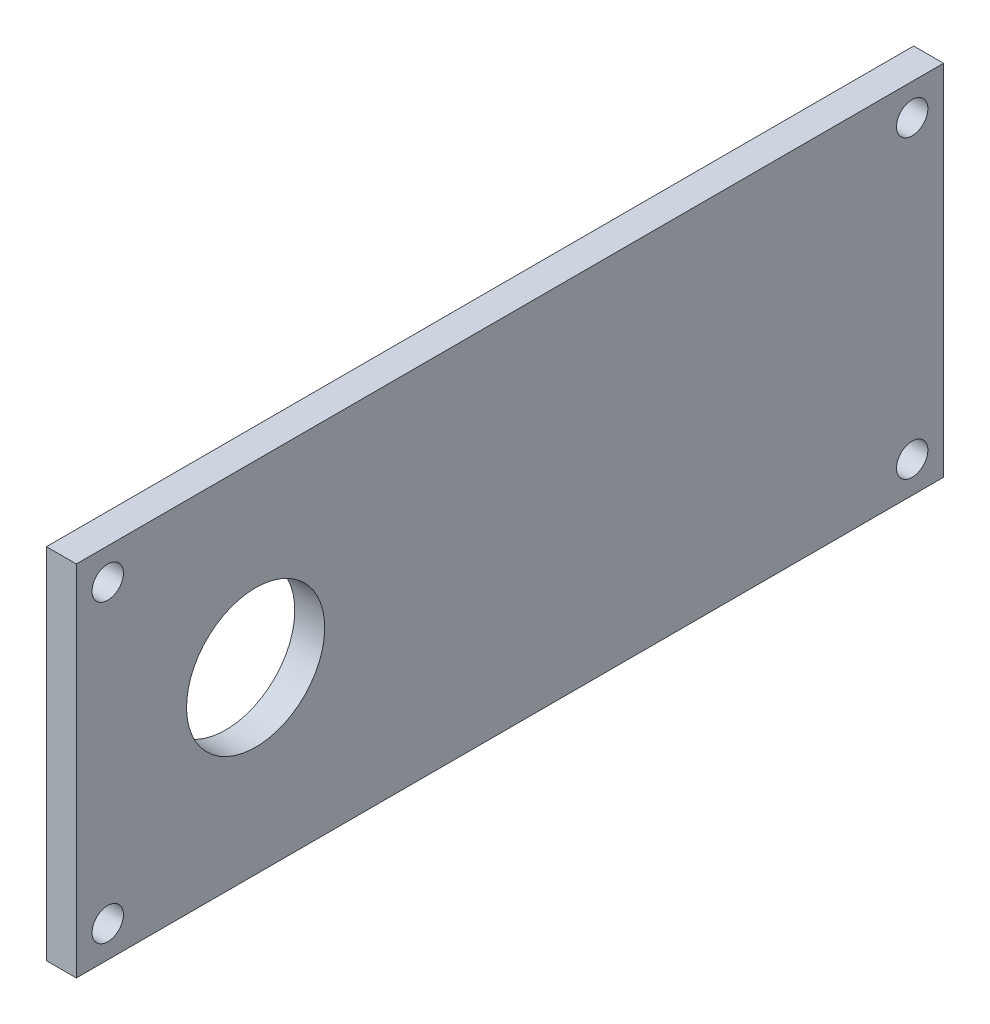
ISO-10303-21;
HEADER;
FILE_DESCRIPTION(('STEP AP214'),'2;1');
FILE_NAME('part.step','',(''),(''),'','','');
FILE_SCHEMA(('AUTOMOTIVE_DESIGN { 1 0 10303 214 1 1 1 1 }'));
ENDSEC;
DATA;
#1=APPLICATION_CONTEXT('core data for automotive mechanical design processes');
#2=APPLICATION_PROTOCOL_DEFINITION('international standard','automotive_design',2000,#1);
#3=PRODUCT_CONTEXT('',#1,'mechanical');
#4=PRODUCT('Part','Part','',(#3));
#5=PRODUCT_RELATED_PRODUCT_CATEGORY('part','',(#4));
#6=PRODUCT_DEFINITION_FORMATION('','',#4);
#7=PRODUCT_DEFINITION_CONTEXT('part definition',#1,'design');
#8=PRODUCT_DEFINITION('design','',#6,#7);
#9=PRODUCT_DEFINITION_SHAPE('','',#8);
#10=(LENGTH_UNIT() NAMED_UNIT(*) SI_UNIT(.MILLI.,.METRE.));
#11=(NAMED_UNIT(*) PLANE_ANGLE_UNIT() SI_UNIT($,.RADIAN.));
#12=(NAMED_UNIT(*) SI_UNIT($,.STERADIAN.) SOLID_ANGLE_UNIT());
#13=UNCERTAINTY_MEASURE_WITH_UNIT(LENGTH_MEASURE(1.E-05),#10,'distance_accuracy_value','');
#14=(GEOMETRIC_REPRESENTATION_CONTEXT(3) GLOBAL_UNCERTAINTY_ASSIGNED_CONTEXT((#13)) GLOBAL_UNIT_ASSIGNED_CONTEXT((#10,
#11,#12)) REPRESENTATION_CONTEXT('',''));
#15=CARTESIAN_POINT('',(0.,0.,0.));
#16=DIRECTION('',(0.,0.,1.));
#17=DIRECTION('',(1.,0.,0.));
#18=AXIS2_PLACEMENT_3D('',#15,#16,#17);
#19=CARTESIAN_POINT('',(-87.7327380887072,6.18052461297292E-13,0.));
#20=DIRECTION('',(-1.,0.,0.));
#21=DIRECTION('',(0.,-1.,0.));
#22=AXIS2_PLACEMENT_3D('',#19,#20,#21);
#23=PLANE('',#22);
#24=CARTESIAN_POINT('',(-87.7327380887078,-74.6077986319809,-25.1580486265835));
#25=DIRECTION('',(-1.,0.,0.));
#26=DIRECTION('',(0.,-1.,0.));
#27=AXIS2_PLACEMENT_3D('',#24,#25,#26);
#28=CIRCLE('',#27,2.5);
#29=CARTESIAN_POINT('',(-87.7327380887077,-72.1077986319809,-25.1580486265835));
#30=VERTEX_POINT('',#29);
#31=EDGE_CURVE('E126',#30,#30,#28,.T.);
#32=ORIENTED_EDGE('',*,*,#31,.F.);
#33=EDGE_LOOP('',(#32));
#34=FACE_BOUND('',#33,.T.);
#35=CARTESIAN_POINT('',(-87.7327380887078,-74.6077986319811,-153.258048626583));
#36=DIRECTION('',(-1.,0.,0.));
#37=DIRECTION('',(0.,-1.,0.));
#38=AXIS2_PLACEMENT_3D('',#35,#36,#37);
#39=CIRCLE('',#38,2.5);
#40=CARTESIAN_POINT('',(-87.7327380887077,-72.1077986319811,-153.258048626583));
#41=VERTEX_POINT('',#40);
#42=EDGE_CURVE('E114',#41,#41,#39,.T.);
#43=ORIENTED_EDGE('',*,*,#42,.F.);
#44=EDGE_LOOP('',(#43));
#45=FACE_BOUND('',#44,.T.);
#46=DIRECTION('',(0.,-1.,0.));
#47=VECTOR('',#46,1.);
#48=CARTESIAN_POINT('',(-87.7327380887074,-22.5077986319807,-158.258048626584));
#49=LINE('',#48,#47);
#50=CARTESIAN_POINT('',(-87.7327380887074,-22.5077986319807,-158.258048626584));
#51=VERTEX_POINT('',#50);
#52=CARTESIAN_POINT('',(-87.7327380887078,-79.6077986319808,-158.258048626584));
#53=VERTEX_POINT('',#52);
#54=EDGE_CURVE('E84',#51,#53,#49,.T.);
#55=ORIENTED_EDGE('',*,*,#54,.T.);
#56=DIRECTION('',(0.,0.,1.));
#57=VECTOR('',#56,1.);
#58=CARTESIAN_POINT('',(-87.7327380887078,-79.6077986319808,-158.258048626584));
#59=LINE('',#58,#57);
#60=CARTESIAN_POINT('',(-87.7327380887078,-79.6077986319806,-20.1580486265835));
#61=VERTEX_POINT('',#60);
#62=EDGE_CURVE('E79',#53,#61,#59,.T.);
#63=ORIENTED_EDGE('',*,*,#62,.T.);
#64=DIRECTION('',(0.,1.,0.));
#65=VECTOR('',#64,1.);
#66=CARTESIAN_POINT('',(-87.7327380887078,-79.6077986319806,-20.1580486265835));
#67=LINE('',#66,#65);
#68=CARTESIAN_POINT('',(-87.7327380887074,-22.5077986319806,-20.1580486265835));
#69=VERTEX_POINT('',#68);
#70=EDGE_CURVE('E82',#61,#69,#67,.T.);
#71=ORIENTED_EDGE('',*,*,#70,.T.);
#72=DIRECTION('',(0.,0.,-1.));
#73=VECTOR('',#72,1.);
#74=CARTESIAN_POINT('',(-87.7327380887074,-22.5077986319806,-20.1580486265835));
#75=LINE('',#74,#73);
#76=EDGE_CURVE('E49',#69,#51,#75,.T.);
#77=ORIENTED_EDGE('',*,*,#76,.T.);
#78=EDGE_LOOP('',(#55,#63,#71,#77));
#79=FACE_BOUND('',#78,.T.);
#80=CARTESIAN_POINT('',(-87.7327380887074,-27.507798631981,-153.258048626583));
#81=DIRECTION('',(-1.,0.,0.));
#82=DIRECTION('',(0.,-1.,0.));
#83=AXIS2_PLACEMENT_3D('',#80,#81,#82);
#84=CIRCLE('',#83,2.5);
#85=CARTESIAN_POINT('',(-87.7327380887074,-25.007798631981,-153.258048626583));
#86=VERTEX_POINT('',#85);
#87=EDGE_CURVE('E99',#86,#86,#84,.T.);
#88=ORIENTED_EDGE('',*,*,#87,.F.);
#89=EDGE_LOOP('',(#88));
#90=FACE_BOUND('',#89,.T.);
#91=CARTESIAN_POINT('',(-87.7327380887074,-27.5077986319808,-25.1580486265835));
#92=DIRECTION('',(-1.,0.,0.));
#93=DIRECTION('',(0.,-1.,0.));
#94=AXIS2_PLACEMENT_3D('',#91,#92,#93);
#95=CIRCLE('',#94,2.5);
#96=CARTESIAN_POINT('',(-87.7327380887074,-25.0077986319808,-25.1580486265835));
#97=VERTEX_POINT('',#96);
#98=EDGE_CURVE('E120',#97,#97,#95,.T.);
#99=ORIENTED_EDGE('',*,*,#98,.F.);
#100=EDGE_LOOP('',(#99));
#101=FACE_BOUND('',#100,.T.);
#102=CARTESIAN_POINT('',(-87.7327380887076,-51.0577986319808,-48.7080486265835));
#103=DIRECTION('',(-1.,0.,0.));
#104=DIRECTION('',(0.,-1.,0.));
#105=AXIS2_PLACEMENT_3D('',#102,#103,#104);
#106=CIRCLE('',#105,11.);
#107=CARTESIAN_POINT('',(-87.7327380887075,-40.0577986319809,-48.7080486265835));
#108=VERTEX_POINT('',#107);
#109=EDGE_CURVE('E132',#108,#108,#106,.T.);
#110=ORIENTED_EDGE('',*,*,#109,.F.);
#111=EDGE_LOOP('',(#110));
#112=FACE_BOUND('',#111,.T.);
#113=ADVANCED_FACE('F32',(#34,#45,#79,#90,#101,#112),#23,.T.);
#114=CARTESIAN_POINT('',(-82.9702380887072,5.84796101544812E-13,0.));
#115=DIRECTION('',(-1.,0.,0.));
#116=DIRECTION('',(0.,-1.,0.));
#117=AXIS2_PLACEMENT_3D('',#114,#115,#116);
#118=PLANE('',#117);
#119=DIRECTION('',(0.,-1.,0.));
#120=VECTOR('',#119,1.);
#121=CARTESIAN_POINT('',(-82.9702380887074,-22.5077986319807,-158.258048626584));
#122=LINE('',#121,#120);
#123=CARTESIAN_POINT('',(-82.9702380887074,-22.5077986319807,-158.258048626584));
#124=VERTEX_POINT('',#123);
#125=CARTESIAN_POINT('',(-82.9702380887078,-79.6077986319808,-158.258048626584));
#126=VERTEX_POINT('',#125);
#127=EDGE_CURVE('E96',#124,#126,#122,.T.);
#128=ORIENTED_EDGE('',*,*,#127,.F.);
#129=DIRECTION('',(0.,0.,-1.));
#130=VECTOR('',#129,1.);
#131=CARTESIAN_POINT('',(-82.9702380887074,-22.5077986319807,-20.1580486265835));
#132=LINE('',#131,#130);
#133=CARTESIAN_POINT('',(-82.9702380887074,-22.5077986319807,-20.1580486265835));
#134=VERTEX_POINT('',#133);
#135=EDGE_CURVE('E72',#134,#124,#132,.T.);
#136=ORIENTED_EDGE('',*,*,#135,.F.);
#137=DIRECTION('',(0.,1.,0.));
#138=VECTOR('',#137,1.);
#139=CARTESIAN_POINT('',(-82.9702380887078,-79.6077986319806,-20.1580486265835));
#140=LINE('',#139,#138);
#141=CARTESIAN_POINT('',(-82.9702380887078,-79.6077986319806,-20.1580486265835));
#142=VERTEX_POINT('',#141);
#143=EDGE_CURVE('E66',#142,#134,#140,.T.);
#144=ORIENTED_EDGE('',*,*,#143,.F.);
#145=DIRECTION('',(0.,0.,1.));
#146=VECTOR('',#145,1.);
#147=CARTESIAN_POINT('',(-82.9702380887078,-79.6077986319808,-158.258048626584));
#148=LINE('',#147,#146);
#149=EDGE_CURVE('E88',#126,#142,#148,.T.);
#150=ORIENTED_EDGE('',*,*,#149,.F.);
#151=EDGE_LOOP('',(#128,#136,#144,#150));
#152=FACE_BOUND('',#151,.T.);
#153=CARTESIAN_POINT('',(-82.9702380887074,-27.5077986319811,-153.258048626583));
#154=DIRECTION('',(-1.,0.,0.));
#155=DIRECTION('',(0.,-1.,0.));
#156=AXIS2_PLACEMENT_3D('',#153,#154,#155);
#157=CIRCLE('',#156,2.5);
#158=CARTESIAN_POINT('',(-82.9702380887074,-25.0077986319811,-153.258048626583));
#159=VERTEX_POINT('',#158);
#160=EDGE_CURVE('E111',#159,#159,#157,.T.);
#161=ORIENTED_EDGE('',*,*,#160,.T.);
#162=EDGE_LOOP('',(#161));
#163=FACE_BOUND('',#162,.T.);
#164=CARTESIAN_POINT('',(-82.9702380887078,-74.6077986319811,-153.258048626583));
#165=DIRECTION('',(-1.,0.,0.));
#166=DIRECTION('',(0.,-1.,0.));
#167=AXIS2_PLACEMENT_3D('',#164,#165,#166);
#168=CIRCLE('',#167,2.5);
#169=CARTESIAN_POINT('',(-82.9702380887077,-72.1077986319811,-153.258048626583));
#170=VERTEX_POINT('',#169);
#171=EDGE_CURVE('E117',#170,#170,#168,.T.);
#172=ORIENTED_EDGE('',*,*,#171,.T.);
#173=EDGE_LOOP('',(#172));
#174=FACE_BOUND('',#173,.T.);
#175=CARTESIAN_POINT('',(-82.9702380887074,-27.5077986319809,-25.1580486265835));
#176=DIRECTION('',(-1.,0.,0.));
#177=DIRECTION('',(0.,-1.,0.));
#178=AXIS2_PLACEMENT_3D('',#175,#176,#177);
#179=CIRCLE('',#178,2.5);
#180=CARTESIAN_POINT('',(-82.9702380887074,-25.0077986319809,-25.1580486265835));
#181=VERTEX_POINT('',#180);
#182=EDGE_CURVE('E123',#181,#181,#179,.T.);
#183=ORIENTED_EDGE('',*,*,#182,.T.);
#184=EDGE_LOOP('',(#183));
#185=FACE_BOUND('',#184,.T.);
#186=CARTESIAN_POINT('',(-82.9702380887078,-74.6077986319809,-25.1580486265835));
#187=DIRECTION('',(-1.,0.,0.));
#188=DIRECTION('',(0.,-1.,0.));
#189=AXIS2_PLACEMENT_3D('',#186,#187,#188);
#190=CIRCLE('',#189,2.5);
#191=CARTESIAN_POINT('',(-82.9702380887077,-72.1077986319809,-25.1580486265835));
#192=VERTEX_POINT('',#191);
#193=EDGE_CURVE('E129',#192,#192,#190,.T.);
#194=ORIENTED_EDGE('',*,*,#193,.T.);
#195=EDGE_LOOP('',(#194));
#196=FACE_BOUND('',#195,.T.);
#197=CARTESIAN_POINT('',(-82.9702380887076,-51.0577986319809,-48.7080486265835));
#198=DIRECTION('',(-1.,0.,0.));
#199=DIRECTION('',(0.,-1.,0.));
#200=AXIS2_PLACEMENT_3D('',#197,#198,#199);
#201=CIRCLE('',#200,11.);
#202=CARTESIAN_POINT('',(-82.9702380887075,-40.0577986319809,-48.7080486265835));
#203=VERTEX_POINT('',#202);
#204=EDGE_CURVE('E135',#203,#203,#201,.T.);
#205=ORIENTED_EDGE('',*,*,#204,.T.);
#206=EDGE_LOOP('',(#205));
#207=FACE_BOUND('',#206,.T.);
#208=ADVANCED_FACE('F107',(#152,#163,#174,#185,#196,#207),#118,.F.);
#209=CARTESIAN_POINT('',(-87.7327380887074,-22.5077986319807,-158.258048626584));
#210=DIRECTION('',(0.,0.,1.));
#211=DIRECTION('',(1.,0.,0.));
#212=AXIS2_PLACEMENT_3D('',#209,#210,#211);
#213=PLANE('',#212);
#214=ORIENTED_EDGE('',*,*,#127,.T.);
#215=DIRECTION('',(1.,0.,0.));
#216=VECTOR('',#215,1.);
#217=CARTESIAN_POINT('',(-87.7327380887078,-79.6077986319808,-158.258048626584));
#218=LINE('',#217,#216);
#219=EDGE_CURVE('E11',#53,#126,#218,.T.);
#220=ORIENTED_EDGE('',*,*,#219,.F.);
#221=ORIENTED_EDGE('',*,*,#54,.F.);
#222=DIRECTION('',(1.,0.,0.));
#223=VECTOR('',#222,1.);
#224=CARTESIAN_POINT('',(-87.7327380887074,-22.5077986319807,-158.258048626584));
#225=LINE('',#224,#223);
#226=EDGE_CURVE('E92',#51,#124,#225,.T.);
#227=ORIENTED_EDGE('',*,*,#226,.T.);
#228=EDGE_LOOP('',(#214,#220,#221,#227));
#229=FACE_BOUND('',#228,.T.);
#230=ADVANCED_FACE('F34',(#229),#213,.F.);
#231=CARTESIAN_POINT('',(-87.7327380887078,-79.6077986319808,-158.258048626584));
#232=DIRECTION('',(0.,1.,0.));
#233=DIRECTION('',(-1.,0.,0.));
#234=AXIS2_PLACEMENT_3D('',#231,#232,#233);
#235=PLANE('',#234);
#236=ORIENTED_EDGE('',*,*,#149,.T.);
#237=DIRECTION('',(1.,0.,0.));
#238=VECTOR('',#237,1.);
#239=CARTESIAN_POINT('',(-87.7327380887078,-79.6077986319806,-20.1580486265835));
#240=LINE('',#239,#238);
#241=EDGE_CURVE('E41',#61,#142,#240,.T.);
#242=ORIENTED_EDGE('',*,*,#241,.F.);
#243=ORIENTED_EDGE('',*,*,#62,.F.);
#244=ORIENTED_EDGE('',*,*,#219,.T.);
#245=EDGE_LOOP('',(#236,#242,#243,#244));
#246=FACE_BOUND('',#245,.T.);
#247=ADVANCED_FACE('F87',(#246),#235,.F.);
#248=CARTESIAN_POINT('',(-87.7327380887078,-79.6077986319806,-20.1580486265835));
#249=DIRECTION('',(0.,0.,-1.));
#250=DIRECTION('',(-1.,0.,0.));
#251=AXIS2_PLACEMENT_3D('',#248,#249,#250);
#252=PLANE('',#251);
#253=ORIENTED_EDGE('',*,*,#143,.T.);
#254=DIRECTION('',(1.,0.,0.));
#255=VECTOR('',#254,1.);
#256=CARTESIAN_POINT('',(-87.7327380887074,-22.5077986319806,-20.1580486265835));
#257=LINE('',#256,#255);
#258=EDGE_CURVE('E89',#69,#134,#257,.T.);
#259=ORIENTED_EDGE('',*,*,#258,.F.);
#260=ORIENTED_EDGE('',*,*,#70,.F.);
#261=ORIENTED_EDGE('',*,*,#241,.T.);
#262=EDGE_LOOP('',(#253,#259,#260,#261));
#263=FACE_BOUND('',#262,.T.);
#264=ADVANCED_FACE('F90',(#263),#252,.F.);
#265=CARTESIAN_POINT('',(-87.7327380887074,-22.5077986319806,-20.1580486265835));
#266=DIRECTION('',(0.,-1.,0.));
#267=DIRECTION('',(1.,0.,0.));
#268=AXIS2_PLACEMENT_3D('',#265,#266,#267);
#269=PLANE('',#268);
#270=ORIENTED_EDGE('',*,*,#135,.T.);
#271=ORIENTED_EDGE('',*,*,#226,.F.);
#272=ORIENTED_EDGE('',*,*,#76,.F.);
#273=ORIENTED_EDGE('',*,*,#258,.T.);
#274=EDGE_LOOP('',(#270,#271,#272,#273));
#275=FACE_BOUND('',#274,.T.);
#276=ADVANCED_FACE('F104',(#275),#269,.F.);
#277=CARTESIAN_POINT('',(-87.7327380887074,-27.507798631981,-153.258048626583));
#278=DIRECTION('',(1.,0.,0.));
#279=DIRECTION('',(0.,1.,0.));
#280=AXIS2_PLACEMENT_3D('',#277,#278,#279);
#281=CYLINDRICAL_SURFACE('',#280,2.5);
#282=CARTESIAN_POINT('',(-87.7327380887074,-25.007798631981,-153.258048626583));
#283=CARTESIAN_POINT('',(-87.6831287137074,-25.007798631981,-153.258048626583));
#284=CARTESIAN_POINT('',(-87.6335193387074,-25.007798631981,-153.258048626583));
#285=CARTESIAN_POINT('',(-87.5343005887074,-25.007798631981,-153.258048626583));
#286=CARTESIAN_POINT('',(-87.4846912137074,-25.007798631981,-153.258048626583));
#287=CARTESIAN_POINT('',(-87.3854724637074,-25.007798631981,-153.258048626583));
#288=CARTESIAN_POINT('',(-87.3358630887074,-25.007798631981,-153.258048626583));
#289=CARTESIAN_POINT('',(-87.2366443387074,-25.007798631981,-153.258048626583));
#290=CARTESIAN_POINT('',(-87.1870349637074,-25.007798631981,-153.258048626583));
#291=CARTESIAN_POINT('',(-87.0878162137074,-25.007798631981,-153.258048626583));
#292=CARTESIAN_POINT('',(-87.0382068387074,-25.007798631981,-153.258048626583));
#293=CARTESIAN_POINT('',(-86.9389880887074,-25.007798631981,-153.258048626583));
#294=CARTESIAN_POINT('',(-86.8893787137074,-25.007798631981,-153.258048626583));
#295=CARTESIAN_POINT('',(-86.7901599637074,-25.007798631981,-153.258048626583));
#296=CARTESIAN_POINT('',(-86.7405505887074,-25.007798631981,-153.258048626583));
#297=CARTESIAN_POINT('',(-86.6413318387074,-25.007798631981,-153.258048626583));
#298=CARTESIAN_POINT('',(-86.5917224637074,-25.007798631981,-153.258048626583));
#299=CARTESIAN_POINT('',(-86.4925037137074,-25.007798631981,-153.258048626583));
#300=CARTESIAN_POINT('',(-86.4428943387074,-25.007798631981,-153.258048626583));
#301=CARTESIAN_POINT('',(-86.3436755887074,-25.007798631981,-153.258048626583));
#302=CARTESIAN_POINT('',(-86.2940662137074,-25.007798631981,-153.258048626583));
#303=CARTESIAN_POINT('',(-86.1948474637074,-25.007798631981,-153.258048626583));
#304=CARTESIAN_POINT('',(-86.1452380887074,-25.007798631981,-153.258048626583));
#305=CARTESIAN_POINT('',(-86.0460193387074,-25.007798631981,-153.258048626583));
#306=CARTESIAN_POINT('',(-85.9964099637074,-25.0077986319811,-153.258048626583));
#307=CARTESIAN_POINT('',(-85.8971912137074,-25.0077986319811,-153.258048626583));
#308=CARTESIAN_POINT('',(-85.8475818387074,-25.0077986319811,-153.258048626583));
#309=CARTESIAN_POINT('',(-85.7483630887074,-25.0077986319811,-153.258048626583));
#310=CARTESIAN_POINT('',(-85.6987537137074,-25.0077986319811,-153.258048626583));
#311=CARTESIAN_POINT('',(-85.5995349637074,-25.0077986319811,-153.258048626583));
#312=CARTESIAN_POINT('',(-85.5499255887074,-25.0077986319811,-153.258048626583));
#313=CARTESIAN_POINT('',(-85.4507068387074,-25.0077986319811,-153.258048626583));
#314=CARTESIAN_POINT('',(-85.4010974637074,-25.0077986319811,-153.258048626583));
#315=CARTESIAN_POINT('',(-85.3018787137074,-25.0077986319811,-153.258048626583));
#316=CARTESIAN_POINT('',(-85.2522693387074,-25.0077986319811,-153.258048626583));
#317=CARTESIAN_POINT('',(-85.1530505887074,-25.0077986319811,-153.258048626583));
#318=CARTESIAN_POINT('',(-85.1034412137074,-25.0077986319811,-153.258048626583));
#319=CARTESIAN_POINT('',(-85.0042224637074,-25.0077986319811,-153.258048626583));
#320=CARTESIAN_POINT('',(-84.9546130887074,-25.0077986319811,-153.258048626583));
#321=CARTESIAN_POINT('',(-84.8553943387074,-25.0077986319811,-153.258048626583));
#322=CARTESIAN_POINT('',(-84.8057849637074,-25.0077986319811,-153.258048626583));
#323=CARTESIAN_POINT('',(-84.7065662137074,-25.0077986319811,-153.258048626583));
#324=CARTESIAN_POINT('',(-84.6569568387074,-25.0077986319811,-153.258048626583));
#325=CARTESIAN_POINT('',(-84.5577380887074,-25.0077986319811,-153.258048626583));
#326=CARTESIAN_POINT('',(-84.5081287137074,-25.0077986319811,-153.258048626583));
#327=CARTESIAN_POINT('',(-84.4089099637074,-25.0077986319811,-153.258048626583));
#328=CARTESIAN_POINT('',(-84.3593005887074,-25.0077986319811,-153.258048626583));
#329=CARTESIAN_POINT('',(-84.2600818387074,-25.0077986319811,-153.258048626583));
#330=CARTESIAN_POINT('',(-84.2104724637074,-25.0077986319811,-153.258048626583));
#331=CARTESIAN_POINT('',(-84.1112537137074,-25.0077986319811,-153.258048626583));
#332=CARTESIAN_POINT('',(-84.0616443387074,-25.0077986319811,-153.258048626583));
#333=CARTESIAN_POINT('',(-83.9624255887074,-25.0077986319811,-153.258048626583));
#334=CARTESIAN_POINT('',(-83.9128162137074,-25.0077986319811,-153.258048626583));
#335=CARTESIAN_POINT('',(-83.8135974637074,-25.0077986319811,-153.258048626583));
#336=CARTESIAN_POINT('',(-83.7639880887074,-25.0077986319811,-153.258048626583));
#337=CARTESIAN_POINT('',(-83.6647693387074,-25.0077986319811,-153.258048626583));
#338=CARTESIAN_POINT('',(-83.6151599637074,-25.0077986319811,-153.258048626583));
#339=CARTESIAN_POINT('',(-83.5159412137074,-25.0077986319811,-153.258048626583));
#340=CARTESIAN_POINT('',(-83.4663318387074,-25.0077986319811,-153.258048626583));
#341=CARTESIAN_POINT('',(-83.3671130887074,-25.0077986319811,-153.258048626583));
#342=CARTESIAN_POINT('',(-83.3175037137074,-25.0077986319811,-153.258048626583));
#343=CARTESIAN_POINT('',(-83.2182849637074,-25.0077986319811,-153.258048626583));
#344=CARTESIAN_POINT('',(-83.1686755887074,-25.0077986319811,-153.258048626583));
#345=CARTESIAN_POINT('',(-83.0694568387074,-25.0077986319811,-153.258048626583));
#346=CARTESIAN_POINT('',(-83.0198474637074,-25.0077986319811,-153.258048626583));
#347=CARTESIAN_POINT('',(-82.9702380887074,-25.0077986319811,-153.258048626583));
#348=B_SPLINE_CURVE_WITH_KNOTS('',3,(#282,#283,#284,#285,#286,#287,#288,#289,#290,#291,#292,
#293,#294,#295,#296,#297,#298,#299,#300,#301,#302,#303,#304,#305,#306,#307,#308,#309,#310,#311,
#312,#313,#314,#315,#316,#317,#318,#319,#320,#321,#322,#323,#324,#325,#326,#327,#328,#329,#330,
#331,#332,#333,#334,#335,#336,#337,#338,#339,#340,#341,#342,#343,#344,#345,#346,#347),
.UNSPECIFIED.,.F.,.F.,(4,2,2,2,2,2,2,2,2,2,2,2,2,2,2,2,2,2,2,2,2,2,2,2,2,2,2,2,2,2,2,2,4),(0.,
0.148828125,0.29765625,0.446484375,0.5953125,0.744140625,0.892968750000001,1.041796875,1.190625,
1.339453125,1.48828125,1.637109375,1.7859375,1.934765625,2.08359375,2.232421875,2.38125,
2.530078125,2.67890625,2.827734375,2.9765625,3.125390625,3.27421875,3.423046875,3.571875,
3.720703125,3.86953125,4.018359375,4.1671875,4.316015625,4.46484375,4.613671875,4.7625),.UNSPECIFIED.);
#349=EDGE_CURVE('BSEAM154',#86,#159,#348,.T.);
#350=ORIENTED_EDGE('',*,*,#87,.T.);
#351=ORIENTED_EDGE('',*,*,#160,.F.);
#352=ORIENTED_EDGE('',*,*,#349,.T.);
#353=ORIENTED_EDGE('',*,*,#349,.F.);
#354=EDGE_LOOP('',(#350,#352,#351,#353));
#355=FACE_BOUND('',#354,.T.);
#356=ADVANCED_FACE('F154',(#355),#281,.F.);
#357=CARTESIAN_POINT('',(-87.7327380887078,-74.6077986319811,-153.258048626583));
#358=DIRECTION('',(1.,0.,0.));
#359=DIRECTION('',(0.,1.,0.));
#360=AXIS2_PLACEMENT_3D('',#357,#358,#359);
#361=CYLINDRICAL_SURFACE('',#360,2.5);
#362=CARTESIAN_POINT('',(-87.7327380887077,-72.1077986319811,-153.258048626583));
#363=CARTESIAN_POINT('',(-87.6831287137078,-72.1077986319811,-153.258048626583));
#364=CARTESIAN_POINT('',(-87.6335193387077,-72.1077986319811,-153.258048626583));
#365=CARTESIAN_POINT('',(-87.5343005887078,-72.1077986319811,-153.258048626583));
#366=CARTESIAN_POINT('',(-87.4846912137077,-72.1077986319811,-153.258048626583));
#367=CARTESIAN_POINT('',(-87.3854724637078,-72.1077986319811,-153.258048626583));
#368=CARTESIAN_POINT('',(-87.3358630887078,-72.1077986319811,-153.258048626583));
#369=CARTESIAN_POINT('',(-87.2366443387078,-72.1077986319811,-153.258048626583));
#370=CARTESIAN_POINT('',(-87.1870349637077,-72.1077986319811,-153.258048626583));
#371=CARTESIAN_POINT('',(-87.0878162137078,-72.1077986319811,-153.258048626583));
#372=CARTESIAN_POINT('',(-87.0382068387078,-72.1077986319811,-153.258048626583));
#373=CARTESIAN_POINT('',(-86.9389880887078,-72.1077986319811,-153.258048626583));
#374=CARTESIAN_POINT('',(-86.8893787137077,-72.1077986319811,-153.258048626583));
#375=CARTESIAN_POINT('',(-86.7901599637078,-72.1077986319811,-153.258048626583));
#376=CARTESIAN_POINT('',(-86.7405505887077,-72.1077986319811,-153.258048626583));
#377=CARTESIAN_POINT('',(-86.6413318387078,-72.1077986319811,-153.258048626583));
#378=CARTESIAN_POINT('',(-86.5917224637078,-72.1077986319811,-153.258048626583));
#379=CARTESIAN_POINT('',(-86.4925037137078,-72.1077986319811,-153.258048626583));
#380=CARTESIAN_POINT('',(-86.4428943387077,-72.1077986319811,-153.258048626583));
#381=CARTESIAN_POINT('',(-86.3436755887078,-72.1077986319811,-153.258048626583));
#382=CARTESIAN_POINT('',(-86.2940662137078,-72.1077986319811,-153.258048626583));
#383=CARTESIAN_POINT('',(-86.1948474637078,-72.1077986319811,-153.258048626583));
#384=CARTESIAN_POINT('',(-86.1452380887077,-72.1077986319811,-153.258048626583));
#385=CARTESIAN_POINT('',(-86.0460193387078,-72.1077986319811,-153.258048626583));
#386=CARTESIAN_POINT('',(-85.9964099637077,-72.1077986319811,-153.258048626583));
#387=CARTESIAN_POINT('',(-85.8971912137078,-72.1077986319811,-153.258048626583));
#388=CARTESIAN_POINT('',(-85.8475818387078,-72.1077986319811,-153.258048626583));
#389=CARTESIAN_POINT('',(-85.7483630887078,-72.1077986319811,-153.258048626583));
#390=CARTESIAN_POINT('',(-85.6987537137077,-72.1077986319811,-153.258048626583));
#391=CARTESIAN_POINT('',(-85.5995349637078,-72.1077986319811,-153.258048626583));
#392=CARTESIAN_POINT('',(-85.5499255887078,-72.1077986319811,-153.258048626583));
#393=CARTESIAN_POINT('',(-85.4507068387078,-72.1077986319811,-153.258048626583));
#394=CARTESIAN_POINT('',(-85.4010974637077,-72.1077986319811,-153.258048626583));
#395=CARTESIAN_POINT('',(-85.3018787137078,-72.1077986319811,-153.258048626583));
#396=CARTESIAN_POINT('',(-85.2522693387077,-72.1077986319811,-153.258048626583));
#397=CARTESIAN_POINT('',(-85.1530505887078,-72.1077986319811,-153.258048626583));
#398=CARTESIAN_POINT('',(-85.1034412137078,-72.1077986319811,-153.258048626583));
#399=CARTESIAN_POINT('',(-85.0042224637078,-72.1077986319811,-153.258048626583));
#400=CARTESIAN_POINT('',(-84.9546130887077,-72.1077986319811,-153.258048626583));
#401=CARTESIAN_POINT('',(-84.8553943387078,-72.1077986319811,-153.258048626583));
#402=CARTESIAN_POINT('',(-84.8057849637078,-72.1077986319811,-153.258048626583));
#403=CARTESIAN_POINT('',(-84.7065662137078,-72.1077986319811,-153.258048626583));
#404=CARTESIAN_POINT('',(-84.6569568387077,-72.1077986319811,-153.258048626583));
#405=CARTESIAN_POINT('',(-84.5577380887078,-72.1077986319811,-153.258048626583));
#406=CARTESIAN_POINT('',(-84.5081287137077,-72.1077986319811,-153.258048626583));
#407=CARTESIAN_POINT('',(-84.4089099637078,-72.1077986319811,-153.258048626583));
#408=CARTESIAN_POINT('',(-84.3593005887078,-72.1077986319811,-153.258048626583));
#409=CARTESIAN_POINT('',(-84.2600818387078,-72.1077986319811,-153.258048626583));
#410=CARTESIAN_POINT('',(-84.2104724637077,-72.1077986319811,-153.258048626583));
#411=CARTESIAN_POINT('',(-84.1112537137078,-72.1077986319811,-153.258048626583));
#412=CARTESIAN_POINT('',(-84.0616443387078,-72.1077986319811,-153.258048626583));
#413=CARTESIAN_POINT('',(-83.9624255887078,-72.1077986319811,-153.258048626583));
#414=CARTESIAN_POINT('',(-83.9128162137077,-72.1077986319811,-153.258048626583));
#415=CARTESIAN_POINT('',(-83.8135974637078,-72.1077986319811,-153.258048626583));
#416=CARTESIAN_POINT('',(-83.7639880887077,-72.1077986319811,-153.258048626583));
#417=CARTESIAN_POINT('',(-83.6647693387078,-72.1077986319811,-153.258048626583));
#418=CARTESIAN_POINT('',(-83.6151599637078,-72.1077986319811,-153.258048626583));
#419=CARTESIAN_POINT('',(-83.5159412137078,-72.1077986319811,-153.258048626583));
#420=CARTESIAN_POINT('',(-83.4663318387077,-72.1077986319811,-153.258048626583));
#421=CARTESIAN_POINT('',(-83.3671130887078,-72.1077986319811,-153.258048626583));
#422=CARTESIAN_POINT('',(-83.3175037137078,-72.1077986319811,-153.258048626583));
#423=CARTESIAN_POINT('',(-83.2182849637078,-72.1077986319811,-153.258048626583));
#424=CARTESIAN_POINT('',(-83.1686755887077,-72.1077986319811,-153.258048626583));
#425=CARTESIAN_POINT('',(-83.0694568387078,-72.1077986319811,-153.258048626583));
#426=CARTESIAN_POINT('',(-83.0198474637077,-72.1077986319811,-153.258048626583));
#427=CARTESIAN_POINT('',(-82.9702380887077,-72.1077986319811,-153.258048626583));
#428=B_SPLINE_CURVE_WITH_KNOTS('',3,(#362,#363,#364,#365,#366,#367,#368,#369,#370,#371,#372,
#373,#374,#375,#376,#377,#378,#379,#380,#381,#382,#383,#384,#385,#386,#387,#388,#389,#390,#391,
#392,#393,#394,#395,#396,#397,#398,#399,#400,#401,#402,#403,#404,#405,#406,#407,#408,#409,#410,
#411,#412,#413,#414,#415,#416,#417,#418,#419,#420,#421,#422,#423,#424,#425,#426,#427),
.UNSPECIFIED.,.F.,.F.,(4,2,2,2,2,2,2,2,2,2,2,2,2,2,2,2,2,2,2,2,2,2,2,2,2,2,2,2,2,2,2,2,4),(0.,
0.148828125,0.29765625,0.446484375,0.5953125,0.744140625,0.892968750000001,1.041796875,1.190625,
1.339453125,1.48828125,1.637109375,1.7859375,1.934765625,2.08359375,2.232421875,2.38125,
2.530078125,2.67890625,2.827734375,2.9765625,3.125390625,3.27421875,3.423046875,3.571875,
3.720703125,3.86953125,4.018359375,4.1671875,4.316015625,4.46484375,4.613671875,4.7625),.UNSPECIFIED.);
#429=EDGE_CURVE('BSEAM200',#41,#170,#428,.T.);
#430=ORIENTED_EDGE('',*,*,#42,.T.);
#431=ORIENTED_EDGE('',*,*,#171,.F.);
#432=ORIENTED_EDGE('',*,*,#429,.T.);
#433=ORIENTED_EDGE('',*,*,#429,.F.);
#434=EDGE_LOOP('',(#430,#432,#431,#433));
#435=FACE_BOUND('',#434,.T.);
#436=ADVANCED_FACE('F200',(#435),#361,.F.);
#437=CARTESIAN_POINT('',(-87.7327380887074,-27.5077986319808,-25.1580486265835));
#438=DIRECTION('',(1.,0.,0.));
#439=DIRECTION('',(0.,1.,0.));
#440=AXIS2_PLACEMENT_3D('',#437,#438,#439);
#441=CYLINDRICAL_SURFACE('',#440,2.5);
#442=CARTESIAN_POINT('',(-87.7327380887074,-25.0077986319808,-25.1580486265835));
#443=CARTESIAN_POINT('',(-87.6831287137074,-25.0077986319808,-25.1580486265835));
#444=CARTESIAN_POINT('',(-87.6335193387074,-25.0077986319808,-25.1580486265835));
#445=CARTESIAN_POINT('',(-87.5343005887074,-25.0077986319808,-25.1580486265835));
#446=CARTESIAN_POINT('',(-87.4846912137074,-25.0077986319808,-25.1580486265835));
#447=CARTESIAN_POINT('',(-87.3854724637074,-25.0077986319808,-25.1580486265835));
#448=CARTESIAN_POINT('',(-87.3358630887074,-25.0077986319808,-25.1580486265835));
#449=CARTESIAN_POINT('',(-87.2366443387074,-25.0077986319808,-25.1580486265835));
#450=CARTESIAN_POINT('',(-87.1870349637074,-25.0077986319808,-25.1580486265835));
#451=CARTESIAN_POINT('',(-87.0878162137074,-25.0077986319808,-25.1580486265835));
#452=CARTESIAN_POINT('',(-87.0382068387074,-25.0077986319808,-25.1580486265835));
#453=CARTESIAN_POINT('',(-86.9389880887074,-25.0077986319808,-25.1580486265835));
#454=CARTESIAN_POINT('',(-86.8893787137074,-25.0077986319808,-25.1580486265835));
#455=CARTESIAN_POINT('',(-86.7901599637074,-25.0077986319808,-25.1580486265835));
#456=CARTESIAN_POINT('',(-86.7405505887074,-25.0077986319808,-25.1580486265835));
#457=CARTESIAN_POINT('',(-86.6413318387074,-25.0077986319808,-25.1580486265835));
#458=CARTESIAN_POINT('',(-86.5917224637074,-25.0077986319808,-25.1580486265835));
#459=CARTESIAN_POINT('',(-86.4925037137074,-25.0077986319808,-25.1580486265835));
#460=CARTESIAN_POINT('',(-86.4428943387074,-25.0077986319808,-25.1580486265835));
#461=CARTESIAN_POINT('',(-86.3436755887074,-25.0077986319808,-25.1580486265835));
#462=CARTESIAN_POINT('',(-86.2940662137074,-25.0077986319808,-25.1580486265835));
#463=CARTESIAN_POINT('',(-86.1948474637074,-25.0077986319808,-25.1580486265835));
#464=CARTESIAN_POINT('',(-86.1452380887074,-25.0077986319808,-25.1580486265835));
#465=CARTESIAN_POINT('',(-86.0460193387074,-25.0077986319808,-25.1580486265835));
#466=CARTESIAN_POINT('',(-85.9964099637074,-25.0077986319808,-25.1580486265835));
#467=CARTESIAN_POINT('',(-85.8971912137074,-25.0077986319808,-25.1580486265835));
#468=CARTESIAN_POINT('',(-85.8475818387074,-25.0077986319808,-25.1580486265835));
#469=CARTESIAN_POINT('',(-85.7483630887074,-25.0077986319808,-25.1580486265835));
#470=CARTESIAN_POINT('',(-85.6987537137074,-25.0077986319808,-25.1580486265835));
#471=CARTESIAN_POINT('',(-85.5995349637074,-25.0077986319808,-25.1580486265835));
#472=CARTESIAN_POINT('',(-85.5499255887074,-25.0077986319808,-25.1580486265835));
#473=CARTESIAN_POINT('',(-85.4507068387074,-25.0077986319808,-25.1580486265835));
#474=CARTESIAN_POINT('',(-85.4010974637074,-25.0077986319808,-25.1580486265835));
#475=CARTESIAN_POINT('',(-85.3018787137074,-25.0077986319808,-25.1580486265835));
#476=CARTESIAN_POINT('',(-85.2522693387074,-25.0077986319808,-25.1580486265835));
#477=CARTESIAN_POINT('',(-85.1530505887074,-25.0077986319808,-25.1580486265835));
#478=CARTESIAN_POINT('',(-85.1034412137074,-25.0077986319808,-25.1580486265835));
#479=CARTESIAN_POINT('',(-85.0042224637074,-25.0077986319808,-25.1580486265835));
#480=CARTESIAN_POINT('',(-84.9546130887074,-25.0077986319808,-25.1580486265835));
#481=CARTESIAN_POINT('',(-84.8553943387074,-25.0077986319808,-25.1580486265835));
#482=CARTESIAN_POINT('',(-84.8057849637074,-25.0077986319808,-25.1580486265835));
#483=CARTESIAN_POINT('',(-84.7065662137074,-25.0077986319808,-25.1580486265835));
#484=CARTESIAN_POINT('',(-84.6569568387074,-25.0077986319808,-25.1580486265835));
#485=CARTESIAN_POINT('',(-84.5577380887074,-25.0077986319808,-25.1580486265835));
#486=CARTESIAN_POINT('',(-84.5081287137074,-25.0077986319808,-25.1580486265835));
#487=CARTESIAN_POINT('',(-84.4089099637074,-25.0077986319808,-25.1580486265835));
#488=CARTESIAN_POINT('',(-84.3593005887074,-25.0077986319808,-25.1580486265835));
#489=CARTESIAN_POINT('',(-84.2600818387074,-25.0077986319808,-25.1580486265835));
#490=CARTESIAN_POINT('',(-84.2104724637074,-25.0077986319808,-25.1580486265835));
#491=CARTESIAN_POINT('',(-84.1112537137074,-25.0077986319808,-25.1580486265835));
#492=CARTESIAN_POINT('',(-84.0616443387074,-25.0077986319808,-25.1580486265835));
#493=CARTESIAN_POINT('',(-83.9624255887074,-25.0077986319808,-25.1580486265835));
#494=CARTESIAN_POINT('',(-83.9128162137074,-25.0077986319808,-25.1580486265835));
#495=CARTESIAN_POINT('',(-83.8135974637074,-25.0077986319808,-25.1580486265835));
#496=CARTESIAN_POINT('',(-83.7639880887074,-25.0077986319808,-25.1580486265835));
#497=CARTESIAN_POINT('',(-83.6647693387074,-25.0077986319808,-25.1580486265835));
#498=CARTESIAN_POINT('',(-83.6151599637074,-25.0077986319808,-25.1580486265835));
#499=CARTESIAN_POINT('',(-83.5159412137074,-25.0077986319808,-25.1580486265835));
#500=CARTESIAN_POINT('',(-83.4663318387074,-25.0077986319809,-25.1580486265835));
#501=CARTESIAN_POINT('',(-83.3671130887074,-25.0077986319809,-25.1580486265835));
#502=CARTESIAN_POINT('',(-83.3175037137074,-25.0077986319809,-25.1580486265835));
#503=CARTESIAN_POINT('',(-83.2182849637074,-25.0077986319809,-25.1580486265835));
#504=CARTESIAN_POINT('',(-83.1686755887074,-25.0077986319809,-25.1580486265835));
#505=CARTESIAN_POINT('',(-83.0694568387074,-25.0077986319809,-25.1580486265835));
#506=CARTESIAN_POINT('',(-83.0198474637074,-25.0077986319809,-25.1580486265835));
#507=CARTESIAN_POINT('',(-82.9702380887074,-25.0077986319809,-25.1580486265835));
#508=B_SPLINE_CURVE_WITH_KNOTS('',3,(#442,#443,#444,#445,#446,#447,#448,#449,#450,#451,#452,
#453,#454,#455,#456,#457,#458,#459,#460,#461,#462,#463,#464,#465,#466,#467,#468,#469,#470,#471,
#472,#473,#474,#475,#476,#477,#478,#479,#480,#481,#482,#483,#484,#485,#486,#487,#488,#489,#490,
#491,#492,#493,#494,#495,#496,#497,#498,#499,#500,#501,#502,#503,#504,#505,#506,#507),
.UNSPECIFIED.,.F.,.F.,(4,2,2,2,2,2,2,2,2,2,2,2,2,2,2,2,2,2,2,2,2,2,2,2,2,2,2,2,2,2,2,2,4),(0.,
0.148828125,0.29765625,0.446484375,0.5953125,0.744140625,0.892968750000001,1.041796875,1.190625,
1.339453125,1.48828125,1.637109375,1.7859375,1.934765625,2.08359375,2.232421875,2.38125,
2.530078125,2.67890625,2.827734375,2.9765625,3.125390625,3.27421875,3.423046875,3.571875,
3.720703125,3.86953125,4.018359375,4.1671875,4.316015625,4.46484375,4.613671875,4.7625),.UNSPECIFIED.);
#509=EDGE_CURVE('BSEAM208',#97,#181,#508,.T.);
#510=ORIENTED_EDGE('',*,*,#98,.T.);
#511=ORIENTED_EDGE('',*,*,#182,.F.);
#512=ORIENTED_EDGE('',*,*,#509,.T.);
#513=ORIENTED_EDGE('',*,*,#509,.F.);
#514=EDGE_LOOP('',(#510,#512,#511,#513));
#515=FACE_BOUND('',#514,.T.);
#516=ADVANCED_FACE('F208',(#515),#441,.F.);
#517=CARTESIAN_POINT('',(-87.7327380887078,-74.6077986319809,-25.1580486265835));
#518=DIRECTION('',(1.,0.,0.));
#519=DIRECTION('',(0.,1.,0.));
#520=AXIS2_PLACEMENT_3D('',#517,#518,#519);
#521=CYLINDRICAL_SURFACE('',#520,2.5);
#522=CARTESIAN_POINT('',(-87.7327380887077,-72.1077986319809,-25.1580486265835));
#523=CARTESIAN_POINT('',(-87.6831287137078,-72.1077986319809,-25.1580486265835));
#524=CARTESIAN_POINT('',(-87.6335193387077,-72.1077986319809,-25.1580486265835));
#525=CARTESIAN_POINT('',(-87.5343005887078,-72.1077986319809,-25.1580486265835));
#526=CARTESIAN_POINT('',(-87.4846912137077,-72.1077986319809,-25.1580486265835));
#527=CARTESIAN_POINT('',(-87.3854724637078,-72.1077986319809,-25.1580486265835));
#528=CARTESIAN_POINT('',(-87.3358630887078,-72.1077986319809,-25.1580486265835));
#529=CARTESIAN_POINT('',(-87.2366443387078,-72.1077986319809,-25.1580486265835));
#530=CARTESIAN_POINT('',(-87.1870349637077,-72.1077986319809,-25.1580486265835));
#531=CARTESIAN_POINT('',(-87.0878162137078,-72.1077986319809,-25.1580486265835));
#532=CARTESIAN_POINT('',(-87.0382068387078,-72.1077986319809,-25.1580486265835));
#533=CARTESIAN_POINT('',(-86.9389880887078,-72.1077986319809,-25.1580486265835));
#534=CARTESIAN_POINT('',(-86.8893787137077,-72.1077986319809,-25.1580486265835));
#535=CARTESIAN_POINT('',(-86.7901599637078,-72.1077986319809,-25.1580486265835));
#536=CARTESIAN_POINT('',(-86.7405505887077,-72.1077986319809,-25.1580486265835));
#537=CARTESIAN_POINT('',(-86.6413318387078,-72.1077986319809,-25.1580486265835));
#538=CARTESIAN_POINT('',(-86.5917224637078,-72.1077986319809,-25.1580486265835));
#539=CARTESIAN_POINT('',(-86.4925037137078,-72.1077986319809,-25.1580486265835));
#540=CARTESIAN_POINT('',(-86.4428943387077,-72.1077986319809,-25.1580486265835));
#541=CARTESIAN_POINT('',(-86.3436755887078,-72.1077986319809,-25.1580486265835));
#542=CARTESIAN_POINT('',(-86.2940662137078,-72.1077986319809,-25.1580486265835));
#543=CARTESIAN_POINT('',(-86.1948474637078,-72.1077986319809,-25.1580486265835));
#544=CARTESIAN_POINT('',(-86.1452380887077,-72.1077986319809,-25.1580486265835));
#545=CARTESIAN_POINT('',(-86.0460193387078,-72.1077986319809,-25.1580486265835));
#546=CARTESIAN_POINT('',(-85.9964099637077,-72.1077986319809,-25.1580486265835));
#547=CARTESIAN_POINT('',(-85.8971912137078,-72.1077986319809,-25.1580486265835));
#548=CARTESIAN_POINT('',(-85.8475818387078,-72.1077986319809,-25.1580486265835));
#549=CARTESIAN_POINT('',(-85.7483630887078,-72.1077986319809,-25.1580486265835));
#550=CARTESIAN_POINT('',(-85.6987537137077,-72.1077986319809,-25.1580486265835));
#551=CARTESIAN_POINT('',(-85.5995349637078,-72.1077986319809,-25.1580486265835));
#552=CARTESIAN_POINT('',(-85.5499255887078,-72.1077986319809,-25.1580486265835));
#553=CARTESIAN_POINT('',(-85.4507068387078,-72.1077986319809,-25.1580486265835));
#554=CARTESIAN_POINT('',(-85.4010974637077,-72.1077986319809,-25.1580486265835));
#555=CARTESIAN_POINT('',(-85.3018787137078,-72.1077986319809,-25.1580486265835));
#556=CARTESIAN_POINT('',(-85.2522693387077,-72.1077986319809,-25.1580486265835));
#557=CARTESIAN_POINT('',(-85.1530505887078,-72.1077986319809,-25.1580486265835));
#558=CARTESIAN_POINT('',(-85.1034412137078,-72.1077986319809,-25.1580486265835));
#559=CARTESIAN_POINT('',(-85.0042224637078,-72.1077986319809,-25.1580486265835));
#560=CARTESIAN_POINT('',(-84.9546130887077,-72.1077986319809,-25.1580486265835));
#561=CARTESIAN_POINT('',(-84.8553943387078,-72.1077986319809,-25.1580486265835));
#562=CARTESIAN_POINT('',(-84.8057849637078,-72.1077986319809,-25.1580486265835));
#563=CARTESIAN_POINT('',(-84.7065662137078,-72.1077986319809,-25.1580486265835));
#564=CARTESIAN_POINT('',(-84.6569568387077,-72.1077986319809,-25.1580486265835));
#565=CARTESIAN_POINT('',(-84.5577380887078,-72.1077986319809,-25.1580486265835));
#566=CARTESIAN_POINT('',(-84.5081287137077,-72.1077986319809,-25.1580486265835));
#567=CARTESIAN_POINT('',(-84.4089099637078,-72.1077986319809,-25.1580486265835));
#568=CARTESIAN_POINT('',(-84.3593005887078,-72.1077986319809,-25.1580486265835));
#569=CARTESIAN_POINT('',(-84.2600818387078,-72.1077986319809,-25.1580486265835));
#570=CARTESIAN_POINT('',(-84.2104724637077,-72.1077986319809,-25.1580486265835));
#571=CARTESIAN_POINT('',(-84.1112537137078,-72.1077986319809,-25.1580486265835));
#572=CARTESIAN_POINT('',(-84.0616443387078,-72.1077986319809,-25.1580486265835));
#573=CARTESIAN_POINT('',(-83.9624255887078,-72.1077986319809,-25.1580486265835));
#574=CARTESIAN_POINT('',(-83.9128162137077,-72.1077986319809,-25.1580486265835));
#575=CARTESIAN_POINT('',(-83.8135974637078,-72.1077986319809,-25.1580486265835));
#576=CARTESIAN_POINT('',(-83.7639880887077,-72.1077986319809,-25.1580486265835));
#577=CARTESIAN_POINT('',(-83.6647693387078,-72.1077986319809,-25.1580486265835));
#578=CARTESIAN_POINT('',(-83.6151599637078,-72.1077986319809,-25.1580486265835));
#579=CARTESIAN_POINT('',(-83.5159412137078,-72.1077986319809,-25.1580486265835));
#580=CARTESIAN_POINT('',(-83.4663318387077,-72.1077986319809,-25.1580486265835));
#581=CARTESIAN_POINT('',(-83.3671130887078,-72.1077986319809,-25.1580486265835));
#582=CARTESIAN_POINT('',(-83.3175037137078,-72.1077986319809,-25.1580486265835));
#583=CARTESIAN_POINT('',(-83.2182849637078,-72.1077986319809,-25.1580486265835));
#584=CARTESIAN_POINT('',(-83.1686755887077,-72.1077986319809,-25.1580486265835));
#585=CARTESIAN_POINT('',(-83.0694568387078,-72.1077986319809,-25.1580486265835));
#586=CARTESIAN_POINT('',(-83.0198474637077,-72.1077986319809,-25.1580486265835));
#587=CARTESIAN_POINT('',(-82.9702380887077,-72.1077986319809,-25.1580486265835));
#588=B_SPLINE_CURVE_WITH_KNOTS('',3,(#522,#523,#524,#525,#526,#527,#528,#529,#530,#531,#532,
#533,#534,#535,#536,#537,#538,#539,#540,#541,#542,#543,#544,#545,#546,#547,#548,#549,#550,#551,
#552,#553,#554,#555,#556,#557,#558,#559,#560,#561,#562,#563,#564,#565,#566,#567,#568,#569,#570,
#571,#572,#573,#574,#575,#576,#577,#578,#579,#580,#581,#582,#583,#584,#585,#586,#587),
.UNSPECIFIED.,.F.,.F.,(4,2,2,2,2,2,2,2,2,2,2,2,2,2,2,2,2,2,2,2,2,2,2,2,2,2,2,2,2,2,2,2,4),(0.,
0.148828125,0.29765625,0.446484375,0.5953125,0.744140625,0.892968750000001,1.041796875,1.190625,
1.339453125,1.48828125,1.637109375,1.7859375,1.934765625,2.08359375,2.232421875,2.38125,
2.530078125,2.67890625,2.827734375,2.9765625,3.125390625,3.27421875,3.423046875,3.571875,
3.720703125,3.86953125,4.018359375,4.1671875,4.316015625,4.46484375,4.613671875,4.7625),.UNSPECIFIED.);
#589=EDGE_CURVE('BSEAM216',#30,#192,#588,.T.);
#590=ORIENTED_EDGE('',*,*,#31,.T.);
#591=ORIENTED_EDGE('',*,*,#193,.F.);
#592=ORIENTED_EDGE('',*,*,#589,.T.);
#593=ORIENTED_EDGE('',*,*,#589,.F.);
#594=EDGE_LOOP('',(#590,#592,#591,#593));
#595=FACE_BOUND('',#594,.T.);
#596=ADVANCED_FACE('F216',(#595),#521,.F.);
#597=CARTESIAN_POINT('',(-87.7327380887076,-51.0577986319808,-48.7080486265835));
#598=DIRECTION('',(1.,0.,0.));
#599=DIRECTION('',(0.,1.,0.));
#600=AXIS2_PLACEMENT_3D('',#597,#598,#599);
#601=CYLINDRICAL_SURFACE('',#600,11.);
#602=CARTESIAN_POINT('',(-87.7327380887075,-40.0577986319809,-48.7080486265835));
#603=CARTESIAN_POINT('',(-87.6831287137075,-40.0577986319809,-48.7080486265835));
#604=CARTESIAN_POINT('',(-87.6335193387075,-40.0577986319809,-48.7080486265835));
#605=CARTESIAN_POINT('',(-87.5343005887075,-40.0577986319809,-48.7080486265835));
#606=CARTESIAN_POINT('',(-87.4846912137075,-40.0577986319809,-48.7080486265835));
#607=CARTESIAN_POINT('',(-87.3854724637075,-40.0577986319809,-48.7080486265835));
#608=CARTESIAN_POINT('',(-87.3358630887075,-40.0577986319809,-48.7080486265835));
#609=CARTESIAN_POINT('',(-87.2366443387075,-40.0577986319809,-48.7080486265835));
#610=CARTESIAN_POINT('',(-87.1870349637075,-40.0577986319809,-48.7080486265835));
#611=CARTESIAN_POINT('',(-87.0878162137075,-40.0577986319809,-48.7080486265835));
#612=CARTESIAN_POINT('',(-87.0382068387075,-40.0577986319809,-48.7080486265835));
#613=CARTESIAN_POINT('',(-86.9389880887075,-40.0577986319809,-48.7080486265835));
#614=CARTESIAN_POINT('',(-86.8893787137075,-40.0577986319809,-48.7080486265835));
#615=CARTESIAN_POINT('',(-86.7901599637075,-40.0577986319809,-48.7080486265835));
#616=CARTESIAN_POINT('',(-86.7405505887075,-40.0577986319809,-48.7080486265835));
#617=CARTESIAN_POINT('',(-86.6413318387075,-40.0577986319809,-48.7080486265835));
#618=CARTESIAN_POINT('',(-86.5917224637075,-40.0577986319809,-48.7080486265835));
#619=CARTESIAN_POINT('',(-86.4925037137075,-40.0577986319809,-48.7080486265835));
#620=CARTESIAN_POINT('',(-86.4428943387075,-40.0577986319809,-48.7080486265835));
#621=CARTESIAN_POINT('',(-86.3436755887075,-40.0577986319809,-48.7080486265835));
#622=CARTESIAN_POINT('',(-86.2940662137075,-40.0577986319809,-48.7080486265835));
#623=CARTESIAN_POINT('',(-86.1948474637075,-40.0577986319809,-48.7080486265835));
#624=CARTESIAN_POINT('',(-86.1452380887075,-40.0577986319809,-48.7080486265835));
#625=CARTESIAN_POINT('',(-86.0460193387075,-40.0577986319809,-48.7080486265835));
#626=CARTESIAN_POINT('',(-85.9964099637075,-40.0577986319809,-48.7080486265835));
#627=CARTESIAN_POINT('',(-85.8971912137075,-40.0577986319809,-48.7080486265835));
#628=CARTESIAN_POINT('',(-85.8475818387075,-40.0577986319809,-48.7080486265835));
#629=CARTESIAN_POINT('',(-85.7483630887075,-40.0577986319809,-48.7080486265835));
#630=CARTESIAN_POINT('',(-85.6987537137075,-40.0577986319809,-48.7080486265835));
#631=CARTESIAN_POINT('',(-85.5995349637075,-40.0577986319809,-48.7080486265835));
#632=CARTESIAN_POINT('',(-85.5499255887075,-40.0577986319809,-48.7080486265835));
#633=CARTESIAN_POINT('',(-85.4507068387075,-40.0577986319809,-48.7080486265835));
#634=CARTESIAN_POINT('',(-85.4010974637075,-40.0577986319809,-48.7080486265835));
#635=CARTESIAN_POINT('',(-85.3018787137075,-40.0577986319809,-48.7080486265835));
#636=CARTESIAN_POINT('',(-85.2522693387075,-40.0577986319809,-48.7080486265835));
#637=CARTESIAN_POINT('',(-85.1530505887075,-40.0577986319809,-48.7080486265835));
#638=CARTESIAN_POINT('',(-85.1034412137075,-40.0577986319809,-48.7080486265835));
#639=CARTESIAN_POINT('',(-85.0042224637075,-40.0577986319809,-48.7080486265835));
#640=CARTESIAN_POINT('',(-84.9546130887075,-40.0577986319809,-48.7080486265835));
#641=CARTESIAN_POINT('',(-84.8553943387075,-40.0577986319809,-48.7080486265835));
#642=CARTESIAN_POINT('',(-84.8057849637075,-40.0577986319809,-48.7080486265835));
#643=CARTESIAN_POINT('',(-84.7065662137075,-40.0577986319809,-48.7080486265835));
#644=CARTESIAN_POINT('',(-84.6569568387075,-40.0577986319809,-48.7080486265835));
#645=CARTESIAN_POINT('',(-84.5577380887075,-40.0577986319809,-48.7080486265835));
#646=CARTESIAN_POINT('',(-84.5081287137075,-40.0577986319809,-48.7080486265835));
#647=CARTESIAN_POINT('',(-84.4089099637075,-40.0577986319809,-48.7080486265835));
#648=CARTESIAN_POINT('',(-84.3593005887075,-40.0577986319809,-48.7080486265835));
#649=CARTESIAN_POINT('',(-84.2600818387075,-40.0577986319809,-48.7080486265835));
#650=CARTESIAN_POINT('',(-84.2104724637075,-40.0577986319809,-48.7080486265835));
#651=CARTESIAN_POINT('',(-84.1112537137075,-40.0577986319809,-48.7080486265835));
#652=CARTESIAN_POINT('',(-84.0616443387075,-40.0577986319809,-48.7080486265835));
#653=CARTESIAN_POINT('',(-83.9624255887075,-40.0577986319809,-48.7080486265835));
#654=CARTESIAN_POINT('',(-83.9128162137075,-40.0577986319809,-48.7080486265835));
#655=CARTESIAN_POINT('',(-83.8135974637075,-40.0577986319809,-48.7080486265835));
#656=CARTESIAN_POINT('',(-83.7639880887075,-40.0577986319809,-48.7080486265835));
#657=CARTESIAN_POINT('',(-83.6647693387075,-40.0577986319809,-48.7080486265835));
#658=CARTESIAN_POINT('',(-83.6151599637075,-40.0577986319809,-48.7080486265835));
#659=CARTESIAN_POINT('',(-83.5159412137075,-40.0577986319809,-48.7080486265835));
#660=CARTESIAN_POINT('',(-83.4663318387075,-40.0577986319809,-48.7080486265835));
#661=CARTESIAN_POINT('',(-83.3671130887075,-40.0577986319809,-48.7080486265835));
#662=CARTESIAN_POINT('',(-83.3175037137075,-40.0577986319809,-48.7080486265835));
#663=CARTESIAN_POINT('',(-83.2182849637075,-40.0577986319809,-48.7080486265835));
#664=CARTESIAN_POINT('',(-83.1686755887075,-40.0577986319809,-48.7080486265835));
#665=CARTESIAN_POINT('',(-83.0694568387075,-40.0577986319809,-48.7080486265835));
#666=CARTESIAN_POINT('',(-83.0198474637075,-40.0577986319809,-48.7080486265835));
#667=CARTESIAN_POINT('',(-82.9702380887075,-40.0577986319809,-48.7080486265835));
#668=B_SPLINE_CURVE_WITH_KNOTS('',3,(#602,#603,#604,#605,#606,#607,#608,#609,#610,#611,#612,
#613,#614,#615,#616,#617,#618,#619,#620,#621,#622,#623,#624,#625,#626,#627,#628,#629,#630,#631,
#632,#633,#634,#635,#636,#637,#638,#639,#640,#641,#642,#643,#644,#645,#646,#647,#648,#649,#650,
#651,#652,#653,#654,#655,#656,#657,#658,#659,#660,#661,#662,#663,#664,#665,#666,#667),
.UNSPECIFIED.,.F.,.F.,(4,2,2,2,2,2,2,2,2,2,2,2,2,2,2,2,2,2,2,2,2,2,2,2,2,2,2,2,2,2,2,2,4),(0.,
0.148828125,0.29765625,0.446484375,0.5953125,0.744140625,0.892968750000001,1.041796875,1.190625,
1.339453125,1.48828125,1.637109375,1.7859375,1.934765625,2.08359375,2.232421875,2.38125,
2.530078125,2.67890625,2.827734375,2.9765625,3.125390625,3.27421875,3.423046875,3.571875,
3.720703125,3.86953125,4.018359375,4.1671875,4.316015625,4.46484375,4.613671875,4.7625),.UNSPECIFIED.);
#669=EDGE_CURVE('BSEAM141',#108,#203,#668,.T.);
#670=ORIENTED_EDGE('',*,*,#109,.T.);
#671=ORIENTED_EDGE('',*,*,#204,.F.);
#672=ORIENTED_EDGE('',*,*,#669,.T.);
#673=ORIENTED_EDGE('',*,*,#669,.F.);
#674=EDGE_LOOP('',(#670,#672,#671,#673));
#675=FACE_BOUND('',#674,.T.);
#676=ADVANCED_FACE('F141',(#675),#601,.F.);
#677=CLOSED_SHELL('',(#113,#208,#230,#247,#264,#276,#356,#436,#516,#596,#676));
#678=MANIFOLD_SOLID_BREP('B2',#677);
#679=ADVANCED_BREP_SHAPE_REPRESENTATION('',(#18,#678),#14);
#680=SHAPE_DEFINITION_REPRESENTATION(#9,#679);
ENDSEC;
END-ISO-10303-21;
